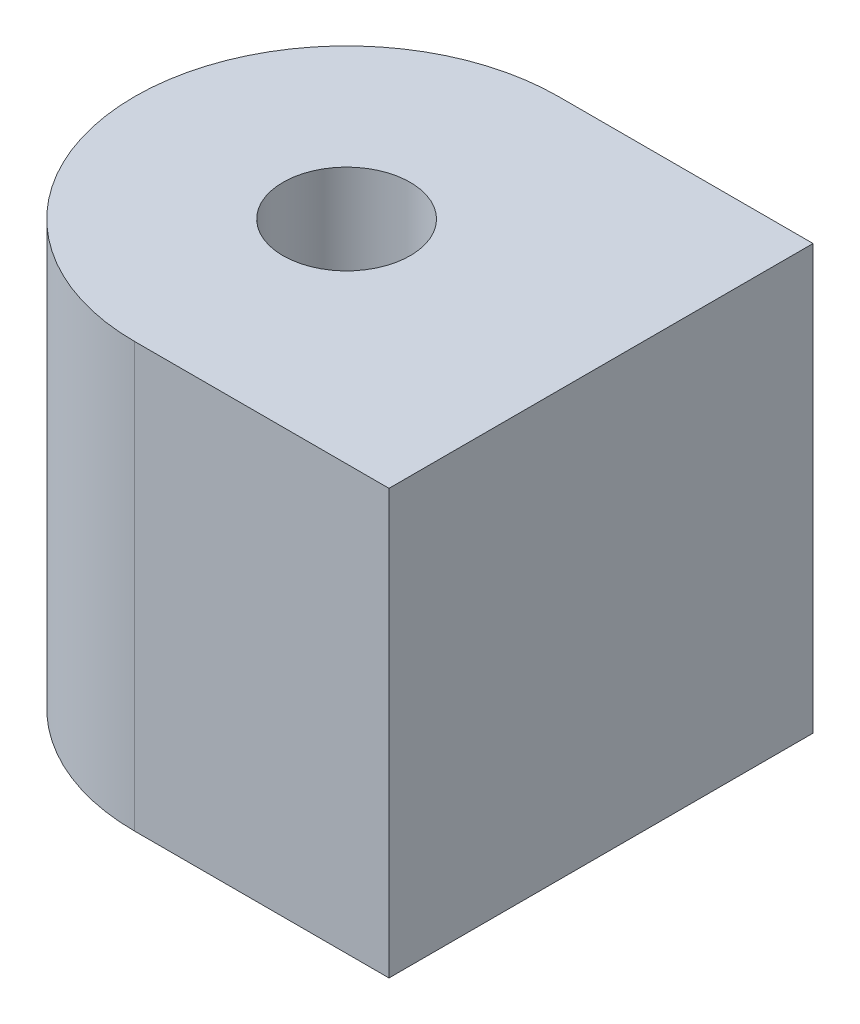
ISO-10303-21;
HEADER;
FILE_DESCRIPTION(('STEP AP214'),'2;1');
FILE_NAME('part.step','',(''),(''),'','','');
FILE_SCHEMA(('AUTOMOTIVE_DESIGN { 1 0 10303 214 1 1 1 1 }'));
ENDSEC;
DATA;
#1=APPLICATION_CONTEXT('core data for automotive mechanical design processes');
#2=APPLICATION_PROTOCOL_DEFINITION('international standard','automotive_design',2000,#1);
#3=PRODUCT_CONTEXT('',#1,'mechanical');
#4=PRODUCT('Part','Part','',(#3));
#5=PRODUCT_RELATED_PRODUCT_CATEGORY('part','',(#4));
#6=PRODUCT_DEFINITION_FORMATION('','',#4);
#7=PRODUCT_DEFINITION_CONTEXT('part definition',#1,'design');
#8=PRODUCT_DEFINITION('design','',#6,#7);
#9=PRODUCT_DEFINITION_SHAPE('','',#8);
#10=(LENGTH_UNIT() NAMED_UNIT(*) SI_UNIT(.MILLI.,.METRE.));
#11=(NAMED_UNIT(*) PLANE_ANGLE_UNIT() SI_UNIT($,.RADIAN.));
#12=(NAMED_UNIT(*) SI_UNIT($,.STERADIAN.) SOLID_ANGLE_UNIT());
#13=UNCERTAINTY_MEASURE_WITH_UNIT(LENGTH_MEASURE(1.E-05),#10,'distance_accuracy_value','');
#14=(GEOMETRIC_REPRESENTATION_CONTEXT(3) GLOBAL_UNCERTAINTY_ASSIGNED_CONTEXT((#13)) GLOBAL_UNIT_ASSIGNED_CONTEXT((#10,
#11,#12)) REPRESENTATION_CONTEXT('',''));
#15=CARTESIAN_POINT('',(0.,0.,0.));
#16=DIRECTION('',(0.,0.,1.));
#17=DIRECTION('',(1.,0.,0.));
#18=AXIS2_PLACEMENT_3D('',#15,#16,#17);
#19=CARTESIAN_POINT('',(0.,0.,0.));
#20=DIRECTION('',(0.,1.,0.));
#21=DIRECTION('',(0.,0.,1.));
#22=AXIS2_PLACEMENT_3D('',#19,#20,#21);
#23=PLANE('',#22);
#24=CARTESIAN_POINT('',(0.,0.,0.));
#25=DIRECTION('',(0.,1.,0.));
#26=DIRECTION('',(0.,0.,1.));
#27=AXIS2_PLACEMENT_3D('',#24,#25,#26);
#28=CIRCLE('',#27,25.);
#29=CARTESIAN_POINT('',(0.,0.,-25.));
#30=VERTEX_POINT('',#29);
#31=CARTESIAN_POINT('',(0.,0.,25.));
#32=VERTEX_POINT('',#31);
#33=EDGE_CURVE('E229',#30,#32,#28,.T.);
#34=ORIENTED_EDGE('',*,*,#33,.F.);
#35=DIRECTION('',(-1.,0.,0.));
#36=VECTOR('',#35,1.);
#37=CARTESIAN_POINT('',(0.,0.,-25.));
#38=LINE('',#37,#36);
#39=CARTESIAN_POINT('',(30.,0.,-25.));
#40=VERTEX_POINT('',#39);
#41=EDGE_CURVE('E60',#40,#30,#38,.T.);
#42=ORIENTED_EDGE('',*,*,#41,.F.);
#43=DIRECTION('',(0.,0.,-1.));
#44=VECTOR('',#43,1.);
#45=CARTESIAN_POINT('',(30.,0.,-25.));
#46=LINE('',#45,#44);
#47=CARTESIAN_POINT('',(30.,0.,25.));
#48=VERTEX_POINT('',#47);
#49=EDGE_CURVE('E447',#48,#40,#46,.T.);
#50=ORIENTED_EDGE('',*,*,#49,.F.);
#51=DIRECTION('',(1.,0.,0.));
#52=VECTOR('',#51,1.);
#53=CARTESIAN_POINT('',(0.,0.,25.));
#54=LINE('',#53,#52);
#55=EDGE_CURVE('E445',#32,#48,#54,.T.);
#56=ORIENTED_EDGE('',*,*,#55,.F.);
#57=EDGE_LOOP('',(#34,#42,#50,#56));
#58=FACE_BOUND('',#57,.T.);
#59=DIRECTION('',(-0.866025403784428,0.,0.500000000000019));
#60=VECTOR('',#59,1.);
#61=CARTESIAN_POINT('',(-3.75416512459886,0.,-6.49759526419164));
#62=LINE('',#61,#60);
#63=CARTESIAN_POINT('',(-3.75,0.,-6.5));
#64=VERTEX_POINT('',#63);
#65=CARTESIAN_POINT('',(-3.75416512459886,0.,-6.49759526419164));
#66=VERTEX_POINT('',#65);
#67=EDGE_CURVE('E52',#64,#66,#62,.T.);
#68=ORIENTED_EDGE('',*,*,#67,.T.);
#69=DIRECTION('',(-0.928457391309651,0.,-0.371438921658026));
#70=VECTOR('',#69,1.);
#71=CARTESIAN_POINT('',(-3.75416512459886,0.,-6.49759526419164));
#72=LINE('',#71,#70);
#73=CARTESIAN_POINT('',(-12.0617837526215,0.,-9.82114347827412));
#74=VERTEX_POINT('',#73);
#75=EDGE_CURVE('E329',#66,#74,#72,.T.);
#76=ORIENTED_EDGE('',*,*,#75,.T.);
#77=CARTESIAN_POINT('',(-12.9903810567666,0.,-7.49999999999999));
#78=DIRECTION('',(0.,1.,0.));
#79=DIRECTION('',(0.,0.,1.));
#80=AXIS2_PLACEMENT_3D('',#77,#78,#79);
#81=CIRCLE('',#80,2.5);
#82=CARTESIAN_POINT('',(-14.536251622708,0.,-5.53523940558755));
#83=VERTEX_POINT('',#82);
#84=EDGE_CURVE('E332',#74,#83,#81,.T.);
#85=ORIENTED_EDGE('',*,*,#84,.T.);
#86=DIRECTION('',(0.785904237764975,0.,0.618348226376573));
#87=VECTOR('',#86,1.);
#88=CARTESIAN_POINT('',(-7.50416512459885,0.,-0.00240473580834927));
#89=LINE('',#88,#87);
#90=CARTESIAN_POINT('',(-7.50416512459885,0.,-0.00240473580834927));
#91=VERTEX_POINT('',#90);
#92=EDGE_CURVE('E335',#83,#91,#89,.T.);
#93=ORIENTED_EDGE('',*,*,#92,.T.);
#94=DIRECTION('',(-1.80344496675069E-13,0.,1.));
#95=VECTOR('',#94,1.);
#96=CARTESIAN_POINT('',(-7.50416512459885,0.,0.00240473580835968));
#97=LINE('',#96,#95);
#98=CARTESIAN_POINT('',(-7.50416512459885,0.,0.00240473580835968));
#99=VERTEX_POINT('',#98);
#100=EDGE_CURVE('E338',#91,#99,#97,.T.);
#101=ORIENTED_EDGE('',*,*,#100,.T.);
#102=DIRECTION('',(-0.785904237764974,0.,0.618348226376574));
#103=VECTOR('',#102,1.);
#104=CARTESIAN_POINT('',(-7.50416512459885,0.,0.00240473580835968));
#105=LINE('',#104,#103);
#106=CARTESIAN_POINT('',(-14.536251622708,0.,5.53523940558757));
#107=VERTEX_POINT('',#106);
#108=EDGE_CURVE('E341',#99,#107,#105,.T.);
#109=ORIENTED_EDGE('',*,*,#108,.T.);
#110=CARTESIAN_POINT('',(-12.9903810567666,0.,7.50000000000001));
#111=DIRECTION('',(0.,1.,0.));
#112=DIRECTION('',(0.,0.,1.));
#113=AXIS2_PLACEMENT_3D('',#110,#111,#112);
#114=CIRCLE('',#113,2.5);
#115=CARTESIAN_POINT('',(-12.0617837526215,0.,9.82114347827413));
#116=VERTEX_POINT('',#115);
#117=EDGE_CURVE('E344',#107,#116,#114,.T.);
#118=ORIENTED_EDGE('',*,*,#117,.T.);
#119=DIRECTION('',(0.928457391309651,0.,-0.371438921658027));
#120=VECTOR('',#119,1.);
#121=CARTESIAN_POINT('',(-3.75416512459885,0.,6.49759526419165));
#122=LINE('',#121,#120);
#123=CARTESIAN_POINT('',(-3.75416512459885,0.,6.49759526419165));
#124=VERTEX_POINT('',#123);
#125=EDGE_CURVE('E347',#116,#124,#122,.T.);
#126=ORIENTED_EDGE('',*,*,#125,.T.);
#127=DIRECTION('',(0.866025403784379,0.,0.500000000000103));
#128=VECTOR('',#127,1.);
#129=CARTESIAN_POINT('',(-3.75416512459885,0.,6.49759526419165));
#130=LINE('',#129,#128);
#131=CARTESIAN_POINT('',(-3.75,0.,6.5));
#132=VERTEX_POINT('',#131);
#133=EDGE_CURVE('E350',#124,#132,#130,.T.);
#134=ORIENTED_EDGE('',*,*,#133,.T.);
#135=DIRECTION('',(0.142553153544677,0.,0.9897871480346));
#136=VECTOR('',#135,1.);
#137=CARTESIAN_POINT('',(-3.75,0.,6.5));
#138=LINE('',#137,#136);
#139=CARTESIAN_POINT('',(-2.4744678700865,0.,15.3563828838617));
#140=VERTEX_POINT('',#139);
#141=EDGE_CURVE('E353',#132,#140,#138,.T.);
#142=ORIENTED_EDGE('',*,*,#141,.T.);
#143=CARTESIAN_POINT('',(0.,0.,15.));
#144=DIRECTION('',(0.,1.,0.));
#145=DIRECTION('',(0.,0.,1.));
#146=AXIS2_PLACEMENT_3D('',#143,#144,#145);
#147=CIRCLE('',#146,2.5);
#148=CARTESIAN_POINT('',(2.4744678700865,0.,15.3563828838617));
#149=VERTEX_POINT('',#148);
#150=EDGE_CURVE('E356',#140,#149,#147,.T.);
#151=ORIENTED_EDGE('',*,*,#150,.T.);
#152=DIRECTION('',(0.142553153544676,0.,-0.9897871480346));
#153=VECTOR('',#152,1.);
#154=CARTESIAN_POINT('',(3.75,0.,6.5));
#155=LINE('',#154,#153);
#156=CARTESIAN_POINT('',(3.75,0.,6.5));
#157=VERTEX_POINT('',#156);
#158=EDGE_CURVE('E359',#149,#157,#155,.T.);
#159=ORIENTED_EDGE('',*,*,#158,.T.);
#160=DIRECTION('',(0.86602540378456,0.,-0.49999999999979));
#161=VECTOR('',#160,1.);
#162=CARTESIAN_POINT('',(3.75,0.,6.5));
#163=LINE('',#162,#161);
#164=CARTESIAN_POINT('',(3.75416512459885,0.,6.49759526419164));
#165=VERTEX_POINT('',#164);
#166=EDGE_CURVE('E362',#157,#165,#163,.T.);
#167=ORIENTED_EDGE('',*,*,#166,.T.);
#168=DIRECTION('',(0.928457391309651,0.,0.371438921658026));
#169=VECTOR('',#168,1.);
#170=CARTESIAN_POINT('',(3.75416512459885,0.,6.49759526419164));
#171=LINE('',#170,#169);
#172=CARTESIAN_POINT('',(12.0617837526215,0.,9.82114347827413));
#173=VERTEX_POINT('',#172);
#174=EDGE_CURVE('E365',#165,#173,#171,.T.);
#175=ORIENTED_EDGE('',*,*,#174,.T.);
#176=CARTESIAN_POINT('',(12.9903810567666,0.,7.5));
#177=DIRECTION('',(0.,1.,0.));
#178=DIRECTION('',(0.,0.,1.));
#179=AXIS2_PLACEMENT_3D('',#176,#177,#178);
#180=CIRCLE('',#179,2.5);
#181=CARTESIAN_POINT('',(14.536251622708,0.,5.53523940558756));
#182=VERTEX_POINT('',#181);
#183=EDGE_CURVE('E368',#173,#182,#180,.T.);
#184=ORIENTED_EDGE('',*,*,#183,.T.);
#185=DIRECTION('',(-0.785904237764975,0.,-0.618348226376574));
#186=VECTOR('',#185,1.);
#187=CARTESIAN_POINT('',(7.50416512459885,0.,0.00240473580835274));
#188=LINE('',#187,#186);
#189=CARTESIAN_POINT('',(7.50416512459885,0.,0.00240473580835274));
#190=VERTEX_POINT('',#189);
#191=EDGE_CURVE('E371',#182,#190,#188,.T.);
#192=ORIENTED_EDGE('',*,*,#191,.T.);
#193=DIRECTION('',(-1.80344496675069E-13,0.,-1.));
#194=VECTOR('',#193,1.);
#195=CARTESIAN_POINT('',(7.50416512459885,0.,-0.00240473580835621));
#196=LINE('',#195,#194);
#197=CARTESIAN_POINT('',(7.50416512459885,0.,-0.00240473580835621));
#198=VERTEX_POINT('',#197);
#199=EDGE_CURVE('E374',#190,#198,#196,.T.);
#200=ORIENTED_EDGE('',*,*,#199,.T.);
#201=DIRECTION('',(0.785904237764974,0.,-0.618348226376574));
#202=VECTOR('',#201,1.);
#203=CARTESIAN_POINT('',(7.50416512459885,0.,-0.00240473580835621));
#204=LINE('',#203,#202);
#205=CARTESIAN_POINT('',(14.536251622708,0.,-5.53523940558757));
#206=VERTEX_POINT('',#205);
#207=EDGE_CURVE('E377',#198,#206,#204,.T.);
#208=ORIENTED_EDGE('',*,*,#207,.T.);
#209=CARTESIAN_POINT('',(12.9903810567666,0.,-7.50000000000001));
#210=DIRECTION('',(0.,1.,0.));
#211=DIRECTION('',(0.,0.,1.));
#212=AXIS2_PLACEMENT_3D('',#209,#210,#211);
#213=CIRCLE('',#212,2.5);
#214=CARTESIAN_POINT('',(12.0617837526215,0.,-9.82114347827413));
#215=VERTEX_POINT('',#214);
#216=EDGE_CURVE('E380',#206,#215,#213,.T.);
#217=ORIENTED_EDGE('',*,*,#216,.T.);
#218=DIRECTION('',(-0.928457391309651,0.,0.371438921658027));
#219=VECTOR('',#218,1.);
#220=CARTESIAN_POINT('',(3.75416512459885,0.,-6.49759526419165));
#221=LINE('',#220,#219);
#222=CARTESIAN_POINT('',(3.75416512459885,0.,-6.49759526419165));
#223=VERTEX_POINT('',#222);
#224=EDGE_CURVE('E383',#215,#223,#221,.T.);
#225=ORIENTED_EDGE('',*,*,#224,.T.);
#226=DIRECTION('',(-0.866025403784469,0.,-0.499999999999947));
#227=VECTOR('',#226,1.);
#228=CARTESIAN_POINT('',(3.75416512459885,0.,-6.49759526419165));
#229=LINE('',#228,#227);
#230=CARTESIAN_POINT('',(3.75,0.,-6.5));
#231=VERTEX_POINT('',#230);
#232=EDGE_CURVE('E386',#223,#231,#229,.T.);
#233=ORIENTED_EDGE('',*,*,#232,.T.);
#234=DIRECTION('',(-0.142553153544677,0.,-0.9897871480346));
#235=VECTOR('',#234,1.);
#236=CARTESIAN_POINT('',(3.75,0.,-6.5));
#237=LINE('',#236,#235);
#238=CARTESIAN_POINT('',(2.4744678700865,0.,-15.3563828838617));
#239=VERTEX_POINT('',#238);
#240=EDGE_CURVE('E389',#231,#239,#237,.T.);
#241=ORIENTED_EDGE('',*,*,#240,.T.);
#242=CARTESIAN_POINT('',(0.,0.,-15.));
#243=DIRECTION('',(0.,1.,0.));
#244=DIRECTION('',(0.,0.,1.));
#245=AXIS2_PLACEMENT_3D('',#242,#243,#244);
#246=CIRCLE('',#245,2.5);
#247=CARTESIAN_POINT('',(-2.4744678700865,0.,-15.3563828838617));
#248=VERTEX_POINT('',#247);
#249=EDGE_CURVE('E392',#239,#248,#246,.T.);
#250=ORIENTED_EDGE('',*,*,#249,.T.);
#251=DIRECTION('',(-0.142553153544677,0.,0.9897871480346));
#252=VECTOR('',#251,1.);
#253=CARTESIAN_POINT('',(-3.75,0.,-6.5));
#254=LINE('',#253,#252);
#255=EDGE_CURVE('E258',#248,#64,#254,.T.);
#256=ORIENTED_EDGE('',*,*,#255,.T.);
#257=EDGE_LOOP('',(#68,#76,#85,#93,#101,#109,#118,#126,#134,#142,#151,#159,#167,#175,#184,#192,
#200,#208,#217,#225,#233,#241,#250,#256));
#258=FACE_BOUND('',#257,.T.);
#259=ADVANCED_FACE('F37',(#58,#258),#23,.F.);
#260=CARTESIAN_POINT('',(0.,20.,0.));
#261=DIRECTION('',(0.,-1.,0.));
#262=DIRECTION('',(0.,0.,-1.));
#263=AXIS2_PLACEMENT_3D('',#260,#261,#262);
#264=CYLINDRICAL_SURFACE('',#263,25.);
#265=ORIENTED_EDGE('',*,*,#33,.T.);
#266=DIRECTION('',(0.,-1.,0.));
#267=VECTOR('',#266,1.);
#268=CARTESIAN_POINT('',(0.,20.,25.));
#269=LINE('',#268,#267);
#270=CARTESIAN_POINT('',(0.,50.,25.));
#271=VERTEX_POINT('',#270);
#272=EDGE_CURVE('E11',#271,#32,#269,.T.);
#273=ORIENTED_EDGE('',*,*,#272,.F.);
#274=CARTESIAN_POINT('',(0.,50.,0.));
#275=DIRECTION('',(0.,1.,0.));
#276=DIRECTION('',(0.,0.,1.));
#277=AXIS2_PLACEMENT_3D('',#274,#275,#276);
#278=CIRCLE('',#277,25.);
#279=CARTESIAN_POINT('',(0.,50.,-25.));
#280=VERTEX_POINT('',#279);
#281=EDGE_CURVE('E227',#280,#271,#278,.T.);
#282=ORIENTED_EDGE('',*,*,#281,.F.);
#283=DIRECTION('',(0.,-1.,0.));
#284=VECTOR('',#283,1.);
#285=CARTESIAN_POINT('',(0.,20.,-25.));
#286=LINE('',#285,#284);
#287=EDGE_CURVE('E450',#280,#30,#286,.T.);
#288=ORIENTED_EDGE('',*,*,#287,.T.);
#289=EDGE_LOOP('',(#265,#273,#282,#288));
#290=FACE_BOUND('',#289,.T.);
#291=ADVANCED_FACE('F39',(#290),#264,.T.);
#292=CARTESIAN_POINT('',(0.,20.,25.));
#293=DIRECTION('',(0.,0.,-1.));
#294=DIRECTION('',(-1.,0.,0.));
#295=AXIS2_PLACEMENT_3D('',#292,#293,#294);
#296=PLANE('',#295);
#297=ORIENTED_EDGE('',*,*,#55,.T.);
#298=DIRECTION('',(0.,-1.,0.));
#299=VECTOR('',#298,1.);
#300=CARTESIAN_POINT('',(30.,20.,25.));
#301=LINE('',#300,#299);
#302=CARTESIAN_POINT('',(30.,50.,25.));
#303=VERTEX_POINT('',#302);
#304=EDGE_CURVE('E45',#303,#48,#301,.T.);
#305=ORIENTED_EDGE('',*,*,#304,.F.);
#306=DIRECTION('',(1.,0.,0.));
#307=VECTOR('',#306,1.);
#308=CARTESIAN_POINT('',(30.,50.,25.));
#309=LINE('',#308,#307);
#310=EDGE_CURVE('E232',#271,#303,#309,.T.);
#311=ORIENTED_EDGE('',*,*,#310,.F.);
#312=ORIENTED_EDGE('',*,*,#272,.T.);
#313=EDGE_LOOP('',(#297,#305,#311,#312));
#314=FACE_BOUND('',#313,.T.);
#315=ADVANCED_FACE('F233',(#314),#296,.F.);
#316=CARTESIAN_POINT('',(30.,20.,-25.));
#317=DIRECTION('',(-1.,0.,0.));
#318=DIRECTION('',(0.,0.,1.));
#319=AXIS2_PLACEMENT_3D('',#316,#317,#318);
#320=PLANE('',#319);
#321=ORIENTED_EDGE('',*,*,#49,.T.);
#322=DIRECTION('',(0.,-1.,0.));
#323=VECTOR('',#322,1.);
#324=CARTESIAN_POINT('',(30.,20.,-25.));
#325=LINE('',#324,#323);
#326=CARTESIAN_POINT('',(30.,50.,-25.));
#327=VERTEX_POINT('',#326);
#328=EDGE_CURVE('E452',#327,#40,#325,.T.);
#329=ORIENTED_EDGE('',*,*,#328,.F.);
#330=DIRECTION('',(0.,0.,-1.));
#331=VECTOR('',#330,1.);
#332=CARTESIAN_POINT('',(30.,50.,-25.));
#333=LINE('',#332,#331);
#334=EDGE_CURVE('E238',#303,#327,#333,.T.);
#335=ORIENTED_EDGE('',*,*,#334,.F.);
#336=ORIENTED_EDGE('',*,*,#304,.T.);
#337=EDGE_LOOP('',(#321,#329,#335,#336));
#338=FACE_BOUND('',#337,.T.);
#339=ADVANCED_FACE('F455',(#338),#320,.F.);
#340=CARTESIAN_POINT('',(0.,20.,-25.));
#341=DIRECTION('',(0.,0.,1.));
#342=DIRECTION('',(1.,0.,0.));
#343=AXIS2_PLACEMENT_3D('',#340,#341,#342);
#344=PLANE('',#343);
#345=ORIENTED_EDGE('',*,*,#41,.T.);
#346=ORIENTED_EDGE('',*,*,#287,.F.);
#347=DIRECTION('',(-1.,0.,0.));
#348=VECTOR('',#347,1.);
#349=CARTESIAN_POINT('',(0.,50.,-25.));
#350=LINE('',#349,#348);
#351=EDGE_CURVE('E244',#327,#280,#350,.T.);
#352=ORIENTED_EDGE('',*,*,#351,.F.);
#353=ORIENTED_EDGE('',*,*,#328,.T.);
#354=EDGE_LOOP('',(#345,#346,#352,#353));
#355=FACE_BOUND('',#354,.T.);
#356=ADVANCED_FACE('F612',(#355),#344,.F.);
#357=CARTESIAN_POINT('',(-3.75416512459886,20.,-6.49759526419164));
#358=DIRECTION('',(0.500000000000019,0.,0.866025403784428));
#359=DIRECTION('',(0.866025403784428,0.,-0.500000000000019));
#360=AXIS2_PLACEMENT_3D('',#357,#358,#359);
#361=PLANE('',#360);
#362=ORIENTED_EDGE('',*,*,#67,.F.);
#363=DIRECTION('',(0.,-1.,0.));
#364=VECTOR('',#363,1.);
#365=CARTESIAN_POINT('',(-3.75,20.,-6.5));
#366=LINE('',#365,#364);
#367=CARTESIAN_POINT('',(-3.75,20.,-6.5));
#368=VERTEX_POINT('',#367);
#369=EDGE_CURVE('E327',#368,#64,#366,.T.);
#370=ORIENTED_EDGE('',*,*,#369,.F.);
#371=DIRECTION('',(-0.866025403784428,0.,0.500000000000019));
#372=VECTOR('',#371,1.);
#373=CARTESIAN_POINT('',(-3.75416512459886,20.,-6.49759526419164));
#374=LINE('',#373,#372);
#375=CARTESIAN_POINT('',(-3.75416512459886,20.,-6.49759526419164));
#376=VERTEX_POINT('',#375);
#377=EDGE_CURVE('E254',#368,#376,#374,.T.);
#378=ORIENTED_EDGE('',*,*,#377,.T.);
#379=DIRECTION('',(0.,-1.,0.));
#380=VECTOR('',#379,1.);
#381=CARTESIAN_POINT('',(-3.75416512459886,20.,-6.49759526419164));
#382=LINE('',#381,#380);
#383=EDGE_CURVE('E442',#376,#66,#382,.T.);
#384=ORIENTED_EDGE('',*,*,#383,.T.);
#385=EDGE_LOOP('',(#362,#370,#378,#384));
#386=FACE_BOUND('',#385,.T.);
#387=ADVANCED_FACE('F465',(#386),#361,.T.);
#388=CARTESIAN_POINT('',(-3.75416512459886,20.,-6.49759526419164));
#389=DIRECTION('',(-0.371438921658026,0.,0.928457391309651));
#390=DIRECTION('',(0.928457391309651,0.,0.371438921658026));
#391=AXIS2_PLACEMENT_3D('',#388,#389,#390);
#392=PLANE('',#391);
#393=ORIENTED_EDGE('',*,*,#75,.F.);
#394=ORIENTED_EDGE('',*,*,#383,.F.);
#395=DIRECTION('',(-0.928457391309651,0.,-0.371438921658026));
#396=VECTOR('',#395,1.);
#397=CARTESIAN_POINT('',(-3.75416512459886,20.,-6.49759526419164));
#398=LINE('',#397,#396);
#399=CARTESIAN_POINT('',(-12.0617837526215,20.,-9.82114347827412));
#400=VERTEX_POINT('',#399);
#401=EDGE_CURVE('E257',#376,#400,#398,.T.);
#402=ORIENTED_EDGE('',*,*,#401,.T.);
#403=DIRECTION('',(0.,-1.,0.));
#404=VECTOR('',#403,1.);
#405=CARTESIAN_POINT('',(-12.0617837526215,20.,-9.82114347827412));
#406=LINE('',#405,#404);
#407=EDGE_CURVE('E440',#400,#74,#406,.T.);
#408=ORIENTED_EDGE('',*,*,#407,.T.);
#409=EDGE_LOOP('',(#393,#394,#402,#408));
#410=FACE_BOUND('',#409,.T.);
#411=ADVANCED_FACE('F469',(#410),#392,.T.);
#412=CARTESIAN_POINT('',(-12.9903810567666,20.,-7.49999999999999));
#413=DIRECTION('',(0.,-1.,0.));
#414=DIRECTION('',(0.,0.,-1.));
#415=AXIS2_PLACEMENT_3D('',#412,#413,#414);
#416=CYLINDRICAL_SURFACE('',#415,2.5);
#417=ORIENTED_EDGE('',*,*,#84,.F.);
#418=ORIENTED_EDGE('',*,*,#407,.F.);
#419=CARTESIAN_POINT('',(-12.9903810567666,20.,-7.49999999999999));
#420=DIRECTION('',(0.,1.,0.));
#421=DIRECTION('',(0.,0.,1.));
#422=AXIS2_PLACEMENT_3D('',#419,#420,#421);
#423=CIRCLE('',#422,2.5);
#424=CARTESIAN_POINT('',(-14.536251622708,20.,-5.53523940558755));
#425=VERTEX_POINT('',#424);
#426=EDGE_CURVE('E261',#400,#425,#423,.T.);
#427=ORIENTED_EDGE('',*,*,#426,.T.);
#428=DIRECTION('',(0.,-1.,0.));
#429=VECTOR('',#428,1.);
#430=CARTESIAN_POINT('',(-14.536251622708,20.,-5.53523940558755));
#431=LINE('',#430,#429);
#432=EDGE_CURVE('E438',#425,#83,#431,.T.);
#433=ORIENTED_EDGE('',*,*,#432,.T.);
#434=EDGE_LOOP('',(#417,#418,#427,#433));
#435=FACE_BOUND('',#434,.T.);
#436=ADVANCED_FACE('F473',(#435),#416,.F.);
#437=CARTESIAN_POINT('',(-7.50416512459885,20.,-0.00240473580834927));
#438=DIRECTION('',(0.618348226376573,0.,-0.785904237764975));
#439=DIRECTION('',(-0.785904237764975,0.,-0.618348226376573));
#440=AXIS2_PLACEMENT_3D('',#437,#438,#439);
#441=PLANE('',#440);
#442=ORIENTED_EDGE('',*,*,#92,.F.);
#443=ORIENTED_EDGE('',*,*,#432,.F.);
#444=DIRECTION('',(0.785904237764975,0.,0.618348226376573));
#445=VECTOR('',#444,1.);
#446=CARTESIAN_POINT('',(-7.50416512459885,20.,-0.00240473580834927));
#447=LINE('',#446,#445);
#448=CARTESIAN_POINT('',(-7.50416512459885,20.,-0.00240473580834927));
#449=VERTEX_POINT('',#448);
#450=EDGE_CURVE('E264',#425,#449,#447,.T.);
#451=ORIENTED_EDGE('',*,*,#450,.T.);
#452=DIRECTION('',(0.,-1.,0.));
#453=VECTOR('',#452,1.);
#454=CARTESIAN_POINT('',(-7.50416512459885,20.,-0.00240473580834927));
#455=LINE('',#454,#453);
#456=EDGE_CURVE('E436',#449,#91,#455,.T.);
#457=ORIENTED_EDGE('',*,*,#456,.T.);
#458=EDGE_LOOP('',(#442,#443,#451,#457));
#459=FACE_BOUND('',#458,.T.);
#460=ADVANCED_FACE('F478',(#459),#441,.T.);
#461=CARTESIAN_POINT('',(-7.50416512459885,20.,0.00240473580835968));
#462=DIRECTION('',(1.,0.,1.80344496675069E-13));
#463=DIRECTION('',(1.80344496675069E-13,0.,-1.));
#464=AXIS2_PLACEMENT_3D('',#461,#462,#463);
#465=PLANE('',#464);
#466=ORIENTED_EDGE('',*,*,#100,.F.);
#467=ORIENTED_EDGE('',*,*,#456,.F.);
#468=DIRECTION('',(-1.80344496675069E-13,0.,1.));
#469=VECTOR('',#468,1.);
#470=CARTESIAN_POINT('',(-7.50416512459885,20.,0.00240473580835968));
#471=LINE('',#470,#469);
#472=CARTESIAN_POINT('',(-7.50416512459885,20.,0.00240473580835968));
#473=VERTEX_POINT('',#472);
#474=EDGE_CURVE('E267',#449,#473,#471,.T.);
#475=ORIENTED_EDGE('',*,*,#474,.T.);
#476=DIRECTION('',(0.,-1.,0.));
#477=VECTOR('',#476,1.);
#478=CARTESIAN_POINT('',(-7.50416512459885,20.,0.00240473580835968));
#479=LINE('',#478,#477);
#480=EDGE_CURVE('E434',#473,#99,#479,.T.);
#481=ORIENTED_EDGE('',*,*,#480,.T.);
#482=EDGE_LOOP('',(#466,#467,#475,#481));
#483=FACE_BOUND('',#482,.T.);
#484=ADVANCED_FACE('F481',(#483),#465,.T.);
#485=CARTESIAN_POINT('',(-7.50416512459885,20.,0.00240473580835968));
#486=DIRECTION('',(0.618348226376574,0.,0.785904237764974));
#487=DIRECTION('',(0.785904237764974,0.,-0.618348226376574));
#488=AXIS2_PLACEMENT_3D('',#485,#486,#487);
#489=PLANE('',#488);
#490=ORIENTED_EDGE('',*,*,#108,.F.);
#491=ORIENTED_EDGE('',*,*,#480,.F.);
#492=DIRECTION('',(-0.785904237764974,0.,0.618348226376574));
#493=VECTOR('',#492,1.);
#494=CARTESIAN_POINT('',(-7.50416512459885,20.,0.00240473580835968));
#495=LINE('',#494,#493);
#496=CARTESIAN_POINT('',(-14.536251622708,20.,5.53523940558757));
#497=VERTEX_POINT('',#496);
#498=EDGE_CURVE('E270',#473,#497,#495,.T.);
#499=ORIENTED_EDGE('',*,*,#498,.T.);
#500=DIRECTION('',(0.,-1.,0.));
#501=VECTOR('',#500,1.);
#502=CARTESIAN_POINT('',(-14.536251622708,20.,5.53523940558757));
#503=LINE('',#502,#501);
#504=EDGE_CURVE('E432',#497,#107,#503,.T.);
#505=ORIENTED_EDGE('',*,*,#504,.T.);
#506=EDGE_LOOP('',(#490,#491,#499,#505));
#507=FACE_BOUND('',#506,.T.);
#508=ADVANCED_FACE('F485',(#507),#489,.T.);
#509=CARTESIAN_POINT('',(-12.9903810567666,20.,7.50000000000001));
#510=DIRECTION('',(0.,-1.,0.));
#511=DIRECTION('',(0.,0.,-1.));
#512=AXIS2_PLACEMENT_3D('',#509,#510,#511);
#513=CYLINDRICAL_SURFACE('',#512,2.5);
#514=ORIENTED_EDGE('',*,*,#117,.F.);
#515=ORIENTED_EDGE('',*,*,#504,.F.);
#516=CARTESIAN_POINT('',(-12.9903810567666,20.,7.50000000000001));
#517=DIRECTION('',(0.,1.,0.));
#518=DIRECTION('',(0.,0.,1.));
#519=AXIS2_PLACEMENT_3D('',#516,#517,#518);
#520=CIRCLE('',#519,2.5);
#521=CARTESIAN_POINT('',(-12.0617837526215,20.,9.82114347827413));
#522=VERTEX_POINT('',#521);
#523=EDGE_CURVE('E273',#497,#522,#520,.T.);
#524=ORIENTED_EDGE('',*,*,#523,.T.);
#525=DIRECTION('',(0.,-1.,0.));
#526=VECTOR('',#525,1.);
#527=CARTESIAN_POINT('',(-12.0617837526215,20.,9.82114347827413));
#528=LINE('',#527,#526);
#529=EDGE_CURVE('E430',#522,#116,#528,.T.);
#530=ORIENTED_EDGE('',*,*,#529,.T.);
#531=EDGE_LOOP('',(#514,#515,#524,#530));
#532=FACE_BOUND('',#531,.T.);
#533=ADVANCED_FACE('F490',(#532),#513,.F.);
#534=CARTESIAN_POINT('',(-3.75416512459885,20.,6.49759526419165));
#535=DIRECTION('',(-0.371438921658027,0.,-0.928457391309651));
#536=DIRECTION('',(-0.928457391309651,0.,0.371438921658027));
#537=AXIS2_PLACEMENT_3D('',#534,#535,#536);
#538=PLANE('',#537);
#539=ORIENTED_EDGE('',*,*,#125,.F.);
#540=ORIENTED_EDGE('',*,*,#529,.F.);
#541=DIRECTION('',(0.928457391309651,0.,-0.371438921658027));
#542=VECTOR('',#541,1.);
#543=CARTESIAN_POINT('',(-3.75416512459885,20.,6.49759526419165));
#544=LINE('',#543,#542);
#545=CARTESIAN_POINT('',(-3.75416512459885,20.,6.49759526419165));
#546=VERTEX_POINT('',#545);
#547=EDGE_CURVE('E276',#522,#546,#544,.T.);
#548=ORIENTED_EDGE('',*,*,#547,.T.);
#549=DIRECTION('',(0.,-1.,0.));
#550=VECTOR('',#549,1.);
#551=CARTESIAN_POINT('',(-3.75416512459885,20.,6.49759526419165));
#552=LINE('',#551,#550);
#553=EDGE_CURVE('E428',#546,#124,#552,.T.);
#554=ORIENTED_EDGE('',*,*,#553,.T.);
#555=EDGE_LOOP('',(#539,#540,#548,#554));
#556=FACE_BOUND('',#555,.T.);
#557=ADVANCED_FACE('F493',(#556),#538,.T.);
#558=CARTESIAN_POINT('',(-3.75416512459885,20.,6.49759526419165));
#559=DIRECTION('',(0.500000000000103,0.,-0.866025403784379));
#560=DIRECTION('',(-0.866025403784379,0.,-0.500000000000103));
#561=AXIS2_PLACEMENT_3D('',#558,#559,#560);
#562=PLANE('',#561);
#563=ORIENTED_EDGE('',*,*,#133,.F.);
#564=ORIENTED_EDGE('',*,*,#553,.F.);
#565=DIRECTION('',(0.866025403784379,0.,0.500000000000103));
#566=VECTOR('',#565,1.);
#567=CARTESIAN_POINT('',(-3.75416512459885,20.,6.49759526419165));
#568=LINE('',#567,#566);
#569=CARTESIAN_POINT('',(-3.75,20.,6.5));
#570=VERTEX_POINT('',#569);
#571=EDGE_CURVE('E279',#546,#570,#568,.T.);
#572=ORIENTED_EDGE('',*,*,#571,.T.);
#573=DIRECTION('',(0.,-1.,0.));
#574=VECTOR('',#573,1.);
#575=CARTESIAN_POINT('',(-3.75,20.,6.5));
#576=LINE('',#575,#574);
#577=EDGE_CURVE('E426',#570,#132,#576,.T.);
#578=ORIENTED_EDGE('',*,*,#577,.T.);
#579=EDGE_LOOP('',(#563,#564,#572,#578));
#580=FACE_BOUND('',#579,.T.);
#581=ADVANCED_FACE('F497',(#580),#562,.T.);
#582=CARTESIAN_POINT('',(-3.75,20.,6.5));
#583=DIRECTION('',(0.9897871480346,0.,-0.142553153544677));
#584=DIRECTION('',(-0.142553153544677,0.,-0.9897871480346));
#585=AXIS2_PLACEMENT_3D('',#582,#583,#584);
#586=PLANE('',#585);
#587=ORIENTED_EDGE('',*,*,#141,.F.);
#588=ORIENTED_EDGE('',*,*,#577,.F.);
#589=DIRECTION('',(0.142553153544677,0.,0.9897871480346));
#590=VECTOR('',#589,1.);
#591=CARTESIAN_POINT('',(-3.75,20.,6.5));
#592=LINE('',#591,#590);
#593=CARTESIAN_POINT('',(-2.4744678700865,20.,15.3563828838617));
#594=VERTEX_POINT('',#593);
#595=EDGE_CURVE('E282',#570,#594,#592,.T.);
#596=ORIENTED_EDGE('',*,*,#595,.T.);
#597=DIRECTION('',(0.,-1.,0.));
#598=VECTOR('',#597,1.);
#599=CARTESIAN_POINT('',(-2.4744678700865,20.,15.3563828838617));
#600=LINE('',#599,#598);
#601=EDGE_CURVE('E424',#594,#140,#600,.T.);
#602=ORIENTED_EDGE('',*,*,#601,.T.);
#603=EDGE_LOOP('',(#587,#588,#596,#602));
#604=FACE_BOUND('',#603,.T.);
#605=ADVANCED_FACE('F502',(#604),#586,.T.);
#606=CARTESIAN_POINT('',(0.,20.,15.));
#607=DIRECTION('',(0.,-1.,0.));
#608=DIRECTION('',(0.,0.,-1.));
#609=AXIS2_PLACEMENT_3D('',#606,#607,#608);
#610=CYLINDRICAL_SURFACE('',#609,2.5);
#611=ORIENTED_EDGE('',*,*,#150,.F.);
#612=ORIENTED_EDGE('',*,*,#601,.F.);
#613=CARTESIAN_POINT('',(0.,20.,15.));
#614=DIRECTION('',(0.,1.,0.));
#615=DIRECTION('',(0.,0.,1.));
#616=AXIS2_PLACEMENT_3D('',#613,#614,#615);
#617=CIRCLE('',#616,2.5);
#618=CARTESIAN_POINT('',(2.4744678700865,20.,15.3563828838617));
#619=VERTEX_POINT('',#618);
#620=EDGE_CURVE('E285',#594,#619,#617,.T.);
#621=ORIENTED_EDGE('',*,*,#620,.T.);
#622=DIRECTION('',(0.,-1.,0.));
#623=VECTOR('',#622,1.);
#624=CARTESIAN_POINT('',(2.4744678700865,20.,15.3563828838617));
#625=LINE('',#624,#623);
#626=EDGE_CURVE('E422',#619,#149,#625,.T.);
#627=ORIENTED_EDGE('',*,*,#626,.T.);
#628=EDGE_LOOP('',(#611,#612,#621,#627));
#629=FACE_BOUND('',#628,.T.);
#630=ADVANCED_FACE('F505',(#629),#610,.F.);
#631=CARTESIAN_POINT('',(3.75,20.,6.5));
#632=DIRECTION('',(-0.989787148034601,0.,-0.142553153544676));
#633=DIRECTION('',(-0.142553153544676,0.,0.9897871480346));
#634=AXIS2_PLACEMENT_3D('',#631,#632,#633);
#635=PLANE('',#634);
#636=ORIENTED_EDGE('',*,*,#158,.F.);
#637=ORIENTED_EDGE('',*,*,#626,.F.);
#638=DIRECTION('',(0.142553153544676,0.,-0.9897871480346));
#639=VECTOR('',#638,1.);
#640=CARTESIAN_POINT('',(3.75,20.,6.5));
#641=LINE('',#640,#639);
#642=CARTESIAN_POINT('',(3.75,20.,6.5));
#643=VERTEX_POINT('',#642);
#644=EDGE_CURVE('E288',#619,#643,#641,.T.);
#645=ORIENTED_EDGE('',*,*,#644,.T.);
#646=DIRECTION('',(0.,-1.,0.));
#647=VECTOR('',#646,1.);
#648=CARTESIAN_POINT('',(3.75,20.,6.5));
#649=LINE('',#648,#647);
#650=EDGE_CURVE('E420',#643,#157,#649,.T.);
#651=ORIENTED_EDGE('',*,*,#650,.T.);
#652=EDGE_LOOP('',(#636,#637,#645,#651));
#653=FACE_BOUND('',#652,.T.);
#654=ADVANCED_FACE('F509',(#653),#635,.T.);
#655=CARTESIAN_POINT('',(3.75,20.,6.5));
#656=DIRECTION('',(-0.49999999999979,0.,-0.86602540378456));
#657=DIRECTION('',(-0.86602540378456,0.,0.49999999999979));
#658=AXIS2_PLACEMENT_3D('',#655,#656,#657);
#659=PLANE('',#658);
#660=ORIENTED_EDGE('',*,*,#166,.F.);
#661=ORIENTED_EDGE('',*,*,#650,.F.);
#662=DIRECTION('',(0.86602540378456,0.,-0.49999999999979));
#663=VECTOR('',#662,1.);
#664=CARTESIAN_POINT('',(3.75,20.,6.5));
#665=LINE('',#664,#663);
#666=CARTESIAN_POINT('',(3.75416512459885,20.,6.49759526419164));
#667=VERTEX_POINT('',#666);
#668=EDGE_CURVE('E291',#643,#667,#665,.T.);
#669=ORIENTED_EDGE('',*,*,#668,.T.);
#670=DIRECTION('',(0.,-1.,0.));
#671=VECTOR('',#670,1.);
#672=CARTESIAN_POINT('',(3.75416512459885,20.,6.49759526419164));
#673=LINE('',#672,#671);
#674=EDGE_CURVE('E418',#667,#165,#673,.T.);
#675=ORIENTED_EDGE('',*,*,#674,.T.);
#676=EDGE_LOOP('',(#660,#661,#669,#675));
#677=FACE_BOUND('',#676,.T.);
#678=ADVANCED_FACE('F514',(#677),#659,.T.);
#679=CARTESIAN_POINT('',(3.75416512459885,20.,6.49759526419164));
#680=DIRECTION('',(0.371438921658026,0.,-0.928457391309651));
#681=DIRECTION('',(-0.928457391309651,0.,-0.371438921658026));
#682=AXIS2_PLACEMENT_3D('',#679,#680,#681);
#683=PLANE('',#682);
#684=ORIENTED_EDGE('',*,*,#174,.F.);
#685=ORIENTED_EDGE('',*,*,#674,.F.);
#686=DIRECTION('',(0.928457391309651,0.,0.371438921658026));
#687=VECTOR('',#686,1.);
#688=CARTESIAN_POINT('',(3.75416512459885,20.,6.49759526419164));
#689=LINE('',#688,#687);
#690=CARTESIAN_POINT('',(12.0617837526215,20.,9.82114347827413));
#691=VERTEX_POINT('',#690);
#692=EDGE_CURVE('E294',#667,#691,#689,.T.);
#693=ORIENTED_EDGE('',*,*,#692,.T.);
#694=DIRECTION('',(0.,-1.,0.));
#695=VECTOR('',#694,1.);
#696=CARTESIAN_POINT('',(12.0617837526215,20.,9.82114347827413));
#697=LINE('',#696,#695);
#698=EDGE_CURVE('E416',#691,#173,#697,.T.);
#699=ORIENTED_EDGE('',*,*,#698,.T.);
#700=EDGE_LOOP('',(#684,#685,#693,#699));
#701=FACE_BOUND('',#700,.T.);
#702=ADVANCED_FACE('F517',(#701),#683,.T.);
#703=CARTESIAN_POINT('',(12.9903810567666,20.,7.5));
#704=DIRECTION('',(0.,-1.,0.));
#705=DIRECTION('',(0.,0.,-1.));
#706=AXIS2_PLACEMENT_3D('',#703,#704,#705);
#707=CYLINDRICAL_SURFACE('',#706,2.5);
#708=ORIENTED_EDGE('',*,*,#183,.F.);
#709=ORIENTED_EDGE('',*,*,#698,.F.);
#710=CARTESIAN_POINT('',(12.9903810567666,20.,7.5));
#711=DIRECTION('',(0.,1.,0.));
#712=DIRECTION('',(0.,0.,1.));
#713=AXIS2_PLACEMENT_3D('',#710,#711,#712);
#714=CIRCLE('',#713,2.5);
#715=CARTESIAN_POINT('',(14.536251622708,20.,5.53523940558756));
#716=VERTEX_POINT('',#715);
#717=EDGE_CURVE('E297',#691,#716,#714,.T.);
#718=ORIENTED_EDGE('',*,*,#717,.T.);
#719=DIRECTION('',(0.,-1.,0.));
#720=VECTOR('',#719,1.);
#721=CARTESIAN_POINT('',(14.536251622708,20.,5.53523940558756));
#722=LINE('',#721,#720);
#723=EDGE_CURVE('E414',#716,#182,#722,.T.);
#724=ORIENTED_EDGE('',*,*,#723,.T.);
#725=EDGE_LOOP('',(#708,#709,#718,#724));
#726=FACE_BOUND('',#725,.T.);
#727=ADVANCED_FACE('F521',(#726),#707,.F.);
#728=CARTESIAN_POINT('',(7.50416512459885,20.,0.00240473580835274));
#729=DIRECTION('',(-0.618348226376574,0.,0.785904237764975));
#730=DIRECTION('',(0.785904237764975,0.,0.618348226376574));
#731=AXIS2_PLACEMENT_3D('',#728,#729,#730);
#732=PLANE('',#731);
#733=ORIENTED_EDGE('',*,*,#191,.F.);
#734=ORIENTED_EDGE('',*,*,#723,.F.);
#735=DIRECTION('',(-0.785904237764975,0.,-0.618348226376574));
#736=VECTOR('',#735,1.);
#737=CARTESIAN_POINT('',(7.50416512459885,20.,0.00240473580835274));
#738=LINE('',#737,#736);
#739=CARTESIAN_POINT('',(7.50416512459885,20.,0.00240473580835274));
#740=VERTEX_POINT('',#739);
#741=EDGE_CURVE('E300',#716,#740,#738,.T.);
#742=ORIENTED_EDGE('',*,*,#741,.T.);
#743=DIRECTION('',(0.,-1.,0.));
#744=VECTOR('',#743,1.);
#745=CARTESIAN_POINT('',(7.50416512459885,20.,0.00240473580835274));
#746=LINE('',#745,#744);
#747=EDGE_CURVE('E412',#740,#190,#746,.T.);
#748=ORIENTED_EDGE('',*,*,#747,.T.);
#749=EDGE_LOOP('',(#733,#734,#742,#748));
#750=FACE_BOUND('',#749,.T.);
#751=ADVANCED_FACE('F526',(#750),#732,.T.);
#752=CARTESIAN_POINT('',(7.50416512459885,20.,-0.00240473580835621));
#753=DIRECTION('',(-1.,0.,1.80344496675069E-13));
#754=DIRECTION('',(1.80344496675069E-13,0.,1.));
#755=AXIS2_PLACEMENT_3D('',#752,#753,#754);
#756=PLANE('',#755);
#757=ORIENTED_EDGE('',*,*,#199,.F.);
#758=ORIENTED_EDGE('',*,*,#747,.F.);
#759=DIRECTION('',(-1.80344496675069E-13,0.,-1.));
#760=VECTOR('',#759,1.);
#761=CARTESIAN_POINT('',(7.50416512459885,20.,-0.00240473580835621));
#762=LINE('',#761,#760);
#763=CARTESIAN_POINT('',(7.50416512459885,20.,-0.00240473580835621));
#764=VERTEX_POINT('',#763);
#765=EDGE_CURVE('E303',#740,#764,#762,.T.);
#766=ORIENTED_EDGE('',*,*,#765,.T.);
#767=DIRECTION('',(0.,-1.,0.));
#768=VECTOR('',#767,1.);
#769=CARTESIAN_POINT('',(7.50416512459885,20.,-0.00240473580835621));
#770=LINE('',#769,#768);
#771=EDGE_CURVE('E410',#764,#198,#770,.T.);
#772=ORIENTED_EDGE('',*,*,#771,.T.);
#773=EDGE_LOOP('',(#757,#758,#766,#772));
#774=FACE_BOUND('',#773,.T.);
#775=ADVANCED_FACE('F529',(#774),#756,.T.);
#776=CARTESIAN_POINT('',(7.50416512459885,20.,-0.00240473580835621));
#777=DIRECTION('',(-0.618348226376574,0.,-0.785904237764974));
#778=DIRECTION('',(-0.785904237764974,0.,0.618348226376574));
#779=AXIS2_PLACEMENT_3D('',#776,#777,#778);
#780=PLANE('',#779);
#781=ORIENTED_EDGE('',*,*,#207,.F.);
#782=ORIENTED_EDGE('',*,*,#771,.F.);
#783=DIRECTION('',(0.785904237764974,0.,-0.618348226376574));
#784=VECTOR('',#783,1.);
#785=CARTESIAN_POINT('',(7.50416512459885,20.,-0.00240473580835621));
#786=LINE('',#785,#784);
#787=CARTESIAN_POINT('',(14.536251622708,20.,-5.53523940558757));
#788=VERTEX_POINT('',#787);
#789=EDGE_CURVE('E306',#764,#788,#786,.T.);
#790=ORIENTED_EDGE('',*,*,#789,.T.);
#791=DIRECTION('',(0.,-1.,0.));
#792=VECTOR('',#791,1.);
#793=CARTESIAN_POINT('',(14.536251622708,20.,-5.53523940558757));
#794=LINE('',#793,#792);
#795=EDGE_CURVE('E408',#788,#206,#794,.T.);
#796=ORIENTED_EDGE('',*,*,#795,.T.);
#797=EDGE_LOOP('',(#781,#782,#790,#796));
#798=FACE_BOUND('',#797,.T.);
#799=ADVANCED_FACE('F533',(#798),#780,.T.);
#800=CARTESIAN_POINT('',(12.9903810567666,20.,-7.50000000000001));
#801=DIRECTION('',(0.,-1.,0.));
#802=DIRECTION('',(0.,0.,-1.));
#803=AXIS2_PLACEMENT_3D('',#800,#801,#802);
#804=CYLINDRICAL_SURFACE('',#803,2.5);
#805=ORIENTED_EDGE('',*,*,#216,.F.);
#806=ORIENTED_EDGE('',*,*,#795,.F.);
#807=CARTESIAN_POINT('',(12.9903810567666,20.,-7.50000000000001));
#808=DIRECTION('',(0.,1.,0.));
#809=DIRECTION('',(0.,0.,1.));
#810=AXIS2_PLACEMENT_3D('',#807,#808,#809);
#811=CIRCLE('',#810,2.5);
#812=CARTESIAN_POINT('',(12.0617837526215,20.,-9.82114347827413));
#813=VERTEX_POINT('',#812);
#814=EDGE_CURVE('E309',#788,#813,#811,.T.);
#815=ORIENTED_EDGE('',*,*,#814,.T.);
#816=DIRECTION('',(0.,-1.,0.));
#817=VECTOR('',#816,1.);
#818=CARTESIAN_POINT('',(12.0617837526215,20.,-9.82114347827413));
#819=LINE('',#818,#817);
#820=EDGE_CURVE('E406',#813,#215,#819,.T.);
#821=ORIENTED_EDGE('',*,*,#820,.T.);
#822=EDGE_LOOP('',(#805,#806,#815,#821));
#823=FACE_BOUND('',#822,.T.);
#824=ADVANCED_FACE('F538',(#823),#804,.F.);
#825=CARTESIAN_POINT('',(3.75416512459885,20.,-6.49759526419165));
#826=DIRECTION('',(0.371438921658027,0.,0.928457391309651));
#827=DIRECTION('',(0.928457391309651,0.,-0.371438921658027));
#828=AXIS2_PLACEMENT_3D('',#825,#826,#827);
#829=PLANE('',#828);
#830=ORIENTED_EDGE('',*,*,#224,.F.);
#831=ORIENTED_EDGE('',*,*,#820,.F.);
#832=DIRECTION('',(-0.928457391309651,0.,0.371438921658027));
#833=VECTOR('',#832,1.);
#834=CARTESIAN_POINT('',(3.75416512459885,20.,-6.49759526419165));
#835=LINE('',#834,#833);
#836=CARTESIAN_POINT('',(3.75416512459885,20.,-6.49759526419165));
#837=VERTEX_POINT('',#836);
#838=EDGE_CURVE('E312',#813,#837,#835,.T.);
#839=ORIENTED_EDGE('',*,*,#838,.T.);
#840=DIRECTION('',(0.,-1.,0.));
#841=VECTOR('',#840,1.);
#842=CARTESIAN_POINT('',(3.75416512459885,20.,-6.49759526419165));
#843=LINE('',#842,#841);
#844=EDGE_CURVE('E404',#837,#223,#843,.T.);
#845=ORIENTED_EDGE('',*,*,#844,.T.);
#846=EDGE_LOOP('',(#830,#831,#839,#845));
#847=FACE_BOUND('',#846,.T.);
#848=ADVANCED_FACE('F541',(#847),#829,.T.);
#849=CARTESIAN_POINT('',(3.75416512459885,20.,-6.49759526419165));
#850=DIRECTION('',(-0.499999999999947,0.,0.86602540378447));
#851=DIRECTION('',(0.86602540378447,0.,0.499999999999947));
#852=AXIS2_PLACEMENT_3D('',#849,#850,#851);
#853=PLANE('',#852);
#854=ORIENTED_EDGE('',*,*,#232,.F.);
#855=ORIENTED_EDGE('',*,*,#844,.F.);
#856=DIRECTION('',(-0.866025403784469,0.,-0.499999999999947));
#857=VECTOR('',#856,1.);
#858=CARTESIAN_POINT('',(3.75416512459885,20.,-6.49759526419165));
#859=LINE('',#858,#857);
#860=CARTESIAN_POINT('',(3.75,20.,-6.5));
#861=VERTEX_POINT('',#860);
#862=EDGE_CURVE('E315',#837,#861,#859,.T.);
#863=ORIENTED_EDGE('',*,*,#862,.T.);
#864=DIRECTION('',(0.,-1.,0.));
#865=VECTOR('',#864,1.);
#866=CARTESIAN_POINT('',(3.75,20.,-6.5));
#867=LINE('',#866,#865);
#868=EDGE_CURVE('E402',#861,#231,#867,.T.);
#869=ORIENTED_EDGE('',*,*,#868,.T.);
#870=EDGE_LOOP('',(#854,#855,#863,#869));
#871=FACE_BOUND('',#870,.T.);
#872=ADVANCED_FACE('F545',(#871),#853,.T.);
#873=CARTESIAN_POINT('',(3.75,20.,-6.5));
#874=DIRECTION('',(-0.9897871480346,0.,0.142553153544677));
#875=DIRECTION('',(0.142553153544677,0.,0.9897871480346));
#876=AXIS2_PLACEMENT_3D('',#873,#874,#875);
#877=PLANE('',#876);
#878=ORIENTED_EDGE('',*,*,#240,.F.);
#879=ORIENTED_EDGE('',*,*,#868,.F.);
#880=DIRECTION('',(-0.142553153544677,0.,-0.9897871480346));
#881=VECTOR('',#880,1.);
#882=CARTESIAN_POINT('',(3.75,20.,-6.5));
#883=LINE('',#882,#881);
#884=CARTESIAN_POINT('',(2.4744678700865,20.,-15.3563828838617));
#885=VERTEX_POINT('',#884);
#886=EDGE_CURVE('E318',#861,#885,#883,.T.);
#887=ORIENTED_EDGE('',*,*,#886,.T.);
#888=DIRECTION('',(0.,-1.,0.));
#889=VECTOR('',#888,1.);
#890=CARTESIAN_POINT('',(2.4744678700865,20.,-15.3563828838617));
#891=LINE('',#890,#889);
#892=EDGE_CURVE('E400',#885,#239,#891,.T.);
#893=ORIENTED_EDGE('',*,*,#892,.T.);
#894=EDGE_LOOP('',(#878,#879,#887,#893));
#895=FACE_BOUND('',#894,.T.);
#896=ADVANCED_FACE('F549',(#895),#877,.T.);
#897=CARTESIAN_POINT('',(0.,20.,-15.));
#898=DIRECTION('',(0.,-1.,0.));
#899=DIRECTION('',(0.,0.,-1.));
#900=AXIS2_PLACEMENT_3D('',#897,#898,#899);
#901=CYLINDRICAL_SURFACE('',#900,2.5);
#902=ORIENTED_EDGE('',*,*,#249,.F.);
#903=ORIENTED_EDGE('',*,*,#892,.F.);
#904=CARTESIAN_POINT('',(0.,20.,-15.));
#905=DIRECTION('',(0.,1.,0.));
#906=DIRECTION('',(0.,0.,1.));
#907=AXIS2_PLACEMENT_3D('',#904,#905,#906);
#908=CIRCLE('',#907,2.5);
#909=CARTESIAN_POINT('',(-2.4744678700865,20.,-15.3563828838617));
#910=VERTEX_POINT('',#909);
#911=EDGE_CURVE('E321',#885,#910,#908,.T.);
#912=ORIENTED_EDGE('',*,*,#911,.T.);
#913=DIRECTION('',(0.,-1.,0.));
#914=VECTOR('',#913,1.);
#915=CARTESIAN_POINT('',(-2.4744678700865,20.,-15.3563828838617));
#916=LINE('',#915,#914);
#917=EDGE_CURVE('E398',#910,#248,#916,.T.);
#918=ORIENTED_EDGE('',*,*,#917,.T.);
#919=EDGE_LOOP('',(#902,#903,#912,#918));
#920=FACE_BOUND('',#919,.T.);
#921=ADVANCED_FACE('F552',(#920),#901,.F.);
#922=CARTESIAN_POINT('',(-3.75,20.,-6.5));
#923=DIRECTION('',(0.9897871480346,0.,0.142553153544677));
#924=DIRECTION('',(0.142553153544677,0.,-0.9897871480346));
#925=AXIS2_PLACEMENT_3D('',#922,#923,#924);
#926=PLANE('',#925);
#927=ORIENTED_EDGE('',*,*,#255,.F.);
#928=ORIENTED_EDGE('',*,*,#917,.F.);
#929=DIRECTION('',(-0.142553153544677,0.,0.9897871480346));
#930=VECTOR('',#929,1.);
#931=CARTESIAN_POINT('',(-3.75,20.,-6.5));
#932=LINE('',#931,#930);
#933=EDGE_CURVE('E324',#910,#368,#932,.T.);
#934=ORIENTED_EDGE('',*,*,#933,.T.);
#935=ORIENTED_EDGE('',*,*,#369,.T.);
#936=EDGE_LOOP('',(#927,#928,#934,#935));
#937=FACE_BOUND('',#936,.T.);
#938=ADVANCED_FACE('F464',(#937),#926,.T.);
#939=CARTESIAN_POINT('',(0.,20.,0.));
#940=DIRECTION('',(0.,1.,0.));
#941=DIRECTION('',(0.,0.,1.));
#942=AXIS2_PLACEMENT_3D('',#939,#940,#941);
#943=PLANE('',#942);
#944=CARTESIAN_POINT('',(0.,20.,0.));
#945=DIRECTION('',(0.,1.,0.));
#946=DIRECTION('',(0.,0.,1.));
#947=AXIS2_PLACEMENT_3D('',#944,#945,#946);
#948=CIRCLE('',#947,7.5);
#949=CARTESIAN_POINT('',(0.,20.,7.5));
#950=VERTEX_POINT('',#949);
#951=EDGE_CURVE('E248',#950,#950,#948,.T.);
#952=ORIENTED_EDGE('',*,*,#951,.T.);
#953=EDGE_LOOP('',(#952));
#954=FACE_BOUND('',#953,.T.);
#955=ORIENTED_EDGE('',*,*,#401,.F.);
#956=ORIENTED_EDGE('',*,*,#377,.F.);
#957=ORIENTED_EDGE('',*,*,#933,.F.);
#958=ORIENTED_EDGE('',*,*,#911,.F.);
#959=ORIENTED_EDGE('',*,*,#886,.F.);
#960=ORIENTED_EDGE('',*,*,#862,.F.);
#961=ORIENTED_EDGE('',*,*,#838,.F.);
#962=ORIENTED_EDGE('',*,*,#814,.F.);
#963=ORIENTED_EDGE('',*,*,#789,.F.);
#964=ORIENTED_EDGE('',*,*,#765,.F.);
#965=ORIENTED_EDGE('',*,*,#741,.F.);
#966=ORIENTED_EDGE('',*,*,#717,.F.);
#967=ORIENTED_EDGE('',*,*,#692,.F.);
#968=ORIENTED_EDGE('',*,*,#668,.F.);
#969=ORIENTED_EDGE('',*,*,#644,.F.);
#970=ORIENTED_EDGE('',*,*,#620,.F.);
#971=ORIENTED_EDGE('',*,*,#595,.F.);
#972=ORIENTED_EDGE('',*,*,#571,.F.);
#973=ORIENTED_EDGE('',*,*,#547,.F.);
#974=ORIENTED_EDGE('',*,*,#523,.F.);
#975=ORIENTED_EDGE('',*,*,#498,.F.);
#976=ORIENTED_EDGE('',*,*,#474,.F.);
#977=ORIENTED_EDGE('',*,*,#450,.F.);
#978=ORIENTED_EDGE('',*,*,#426,.F.);
#979=EDGE_LOOP('',(#955,#956,#957,#958,#959,#960,#961,#962,#963,#964,#965,#966,#967,#968,#969,
#970,#971,#972,#973,#974,#975,#976,#977,#978));
#980=FACE_BOUND('',#979,.T.);
#981=ADVANCED_FACE('F553',(#954,#980),#943,.F.);
#982=CARTESIAN_POINT('',(0.,50.,0.));
#983=DIRECTION('',(0.,1.,0.));
#984=DIRECTION('',(0.,0.,1.));
#985=AXIS2_PLACEMENT_3D('',#982,#983,#984);
#986=PLANE('',#985);
#987=ORIENTED_EDGE('',*,*,#281,.T.);
#988=ORIENTED_EDGE('',*,*,#310,.T.);
#989=ORIENTED_EDGE('',*,*,#334,.T.);
#990=ORIENTED_EDGE('',*,*,#351,.T.);
#991=EDGE_LOOP('',(#987,#988,#989,#990));
#992=FACE_BOUND('',#991,.T.);
#993=CARTESIAN_POINT('',(0.,50.,0.));
#994=DIRECTION('',(0.,1.,0.));
#995=DIRECTION('',(0.,0.,1.));
#996=AXIS2_PLACEMENT_3D('',#993,#994,#995);
#997=CIRCLE('',#996,7.5);
#998=CARTESIAN_POINT('',(0.,50.,7.5));
#999=VERTEX_POINT('',#998);
#1000=EDGE_CURVE('E245',#999,#999,#997,.T.);
#1001=ORIENTED_EDGE('',*,*,#1000,.F.);
#1002=EDGE_LOOP('',(#1001));
#1003=FACE_BOUND('',#1002,.T.);
#1004=ADVANCED_FACE('F241',(#992,#1003),#986,.T.);
#1005=CARTESIAN_POINT('',(0.,50.,0.));
#1006=DIRECTION('',(0.,-1.,0.));
#1007=DIRECTION('',(0.,0.,-1.));
#1008=AXIS2_PLACEMENT_3D('',#1005,#1006,#1007);
#1009=CYLINDRICAL_SURFACE('',#1008,7.5);
#1010=ORIENTED_EDGE('',*,*,#1000,.T.);
#1011=EDGE_LOOP('',(#1010));
#1012=FACE_BOUND('',#1011,.T.);
#1013=ORIENTED_EDGE('',*,*,#951,.F.);
#1014=EDGE_LOOP('',(#1013));
#1015=FACE_BOUND('',#1014,.T.);
#1016=ADVANCED_FACE('F561',(#1012,#1015),#1009,.F.);
#1017=CLOSED_SHELL('',(#259,#291,#315,#339,#356,#387,#411,#436,#460,#484,#508,#533,#557,#581,
#605,#630,#654,#678,#702,#727,#751,#775,#799,#824,#848,#872,#896,#921,#938,#981,#1004,#1016));
#1018=MANIFOLD_SOLID_BREP('B2',#1017);
#1019=ADVANCED_BREP_SHAPE_REPRESENTATION('',(#18,#1018),#14);
#1020=SHAPE_DEFINITION_REPRESENTATION(#9,#1019);
ENDSEC;
END-ISO-10303-21;
